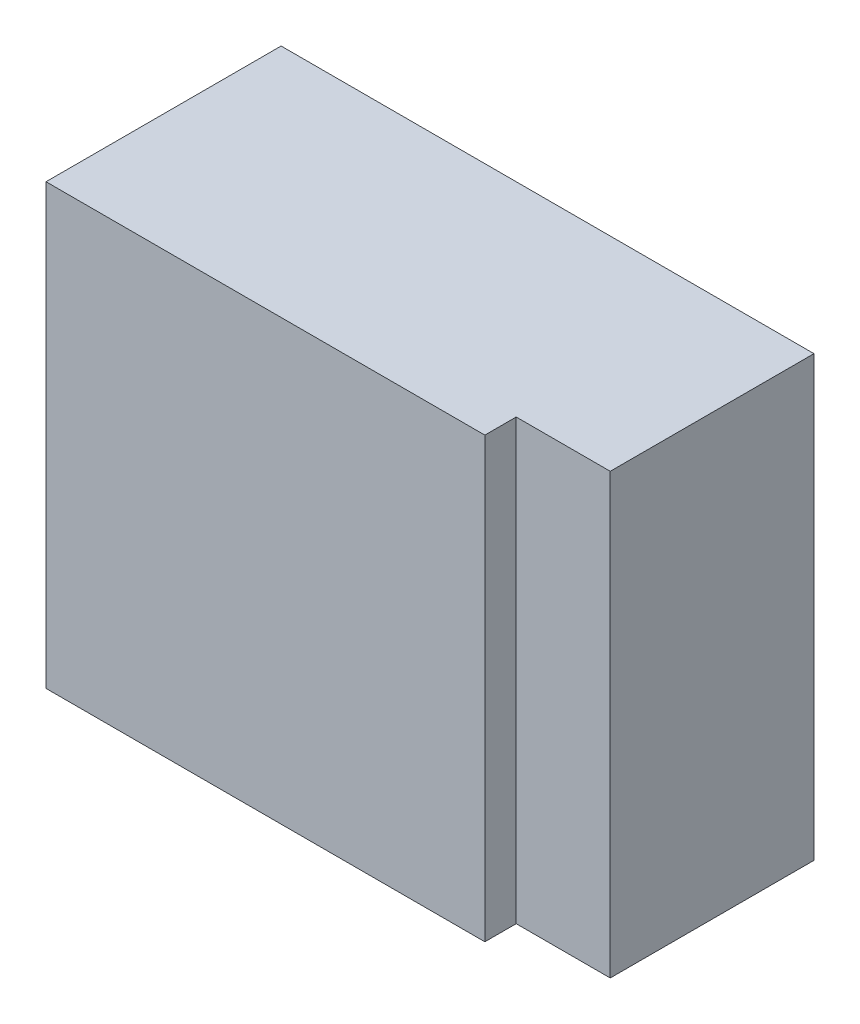
ISO-10303-21;
HEADER;
FILE_DESCRIPTION(('STEP AP214'),'2;1');
FILE_NAME('part.step','',(''),(''),'','','');
FILE_SCHEMA(('AUTOMOTIVE_DESIGN { 1 0 10303 214 1 1 1 1 }'));
ENDSEC;
DATA;
#1=APPLICATION_CONTEXT('core data for automotive mechanical design processes');
#2=APPLICATION_PROTOCOL_DEFINITION('international standard','automotive_design',2000,#1);
#3=PRODUCT_CONTEXT('',#1,'mechanical');
#4=PRODUCT('Part','Part','',(#3));
#5=PRODUCT_RELATED_PRODUCT_CATEGORY('part','',(#4));
#6=PRODUCT_DEFINITION_FORMATION('','',#4);
#7=PRODUCT_DEFINITION_CONTEXT('part definition',#1,'design');
#8=PRODUCT_DEFINITION('design','',#6,#7);
#9=PRODUCT_DEFINITION_SHAPE('','',#8);
#10=(LENGTH_UNIT() NAMED_UNIT(*) SI_UNIT(.MILLI.,.METRE.));
#11=(NAMED_UNIT(*) PLANE_ANGLE_UNIT() SI_UNIT($,.RADIAN.));
#12=(NAMED_UNIT(*) SI_UNIT($,.STERADIAN.) SOLID_ANGLE_UNIT());
#13=UNCERTAINTY_MEASURE_WITH_UNIT(LENGTH_MEASURE(1.E-05),#10,'distance_accuracy_value','');
#14=(GEOMETRIC_REPRESENTATION_CONTEXT(3) GLOBAL_UNCERTAINTY_ASSIGNED_CONTEXT((#13)) GLOBAL_UNIT_ASSIGNED_CONTEXT((#10,
#11,#12)) REPRESENTATION_CONTEXT('',''));
#15=CARTESIAN_POINT('',(0.,0.,0.));
#16=DIRECTION('',(0.,0.,1.));
#17=DIRECTION('',(1.,0.,0.));
#18=AXIS2_PLACEMENT_3D('',#15,#16,#17);
#19=CARTESIAN_POINT('',(1.1,1.4,1.5));
#20=DIRECTION('',(-1.,0.,0.));
#21=DIRECTION('',(0.,0.,1.));
#22=AXIS2_PLACEMENT_3D('',#19,#20,#21);
#23=PLANE('',#22);
#24=DIRECTION('',(0.,0.,1.));
#25=VECTOR('',#24,1.);
#26=CARTESIAN_POINT('',(1.1,-1.4,1.5));
#27=LINE('',#26,#25);
#28=CARTESIAN_POINT('',(1.1,-1.4,1.3));
#29=VERTEX_POINT('',#28);
#30=CARTESIAN_POINT('',(1.1,-1.4,1.5));
#31=VERTEX_POINT('',#30);
#32=EDGE_CURVE('E66',#29,#31,#27,.T.);
#33=ORIENTED_EDGE('',*,*,#32,.F.);
#34=DIRECTION('',(0.,1.,0.));
#35=VECTOR('',#34,1.);
#36=CARTESIAN_POINT('',(1.1,0.,1.3));
#37=LINE('',#36,#35);
#38=CARTESIAN_POINT('',(1.1,1.4,1.3));
#39=VERTEX_POINT('',#38);
#40=EDGE_CURVE('E75',#39,#29,#37,.F.);
#41=ORIENTED_EDGE('',*,*,#40,.F.);
#42=DIRECTION('',(0.,0.,1.));
#43=VECTOR('',#42,1.);
#44=CARTESIAN_POINT('',(1.1,1.4,1.5));
#45=LINE('',#44,#43);
#46=CARTESIAN_POINT('',(1.1,1.4,1.5));
#47=VERTEX_POINT('',#46);
#48=EDGE_CURVE('E20',#47,#39,#45,.F.);
#49=ORIENTED_EDGE('',*,*,#48,.F.);
#50=DIRECTION('',(0.,1.,0.));
#51=VECTOR('',#50,1.);
#52=CARTESIAN_POINT('',(1.1,0.,1.5));
#53=LINE('',#52,#51);
#54=EDGE_CURVE('E85',#31,#47,#53,.T.);
#55=ORIENTED_EDGE('',*,*,#54,.F.);
#56=EDGE_LOOP('',(#33,#41,#49,#55));
#57=FACE_BOUND('',#56,.T.);
#58=ADVANCED_FACE('F17',(#57),#23,.F.);
#59=CARTESIAN_POINT('',(1.4,0.,1.3));
#60=DIRECTION('',(0.,0.,1.));
#61=DIRECTION('',(1.,0.,0.));
#62=AXIS2_PLACEMENT_3D('',#59,#60,#61);
#63=PLANE('',#62);
#64=DIRECTION('',(1.,0.,0.));
#65=VECTOR('',#64,1.);
#66=CARTESIAN_POINT('',(1.7,-1.4,1.3));
#67=LINE('',#66,#65);
#68=CARTESIAN_POINT('',(1.7,-1.4,1.3));
#69=VERTEX_POINT('',#68);
#70=EDGE_CURVE('E96',#69,#29,#67,.F.);
#71=ORIENTED_EDGE('',*,*,#70,.F.);
#72=DIRECTION('',(0.,1.,0.));
#73=VECTOR('',#72,1.);
#74=CARTESIAN_POINT('',(1.7,1.4,1.3));
#75=LINE('',#74,#73);
#76=CARTESIAN_POINT('',(1.7,1.4,1.3));
#77=VERTEX_POINT('',#76);
#78=EDGE_CURVE('E77',#77,#69,#75,.F.);
#79=ORIENTED_EDGE('',*,*,#78,.F.);
#80=DIRECTION('',(1.,0.,0.));
#81=VECTOR('',#80,1.);
#82=CARTESIAN_POINT('',(1.4,1.4,1.3));
#83=LINE('',#82,#81);
#84=EDGE_CURVE('E71',#77,#39,#83,.F.);
#85=ORIENTED_EDGE('',*,*,#84,.T.);
#86=ORIENTED_EDGE('',*,*,#40,.T.);
#87=EDGE_LOOP('',(#71,#79,#85,#86));
#88=FACE_BOUND('',#87,.T.);
#89=ADVANCED_FACE('F74',(#88),#63,.T.);
#90=CARTESIAN_POINT('',(0.,0.,1.5));
#91=DIRECTION('',(0.,0.,1.));
#92=DIRECTION('',(1.,0.,0.));
#93=AXIS2_PLACEMENT_3D('',#90,#91,#92);
#94=PLANE('',#93);
#95=DIRECTION('',(1.,0.,0.));
#96=VECTOR('',#95,1.);
#97=CARTESIAN_POINT('',(1.7,-1.4,1.5));
#98=LINE('',#97,#96);
#99=CARTESIAN_POINT('',(-1.7,-1.4,1.5));
#100=VERTEX_POINT('',#99);
#101=EDGE_CURVE('E93',#31,#100,#98,.F.);
#102=ORIENTED_EDGE('',*,*,#101,.F.);
#103=ORIENTED_EDGE('',*,*,#54,.T.);
#104=DIRECTION('',(1.,0.,0.));
#105=VECTOR('',#104,1.);
#106=CARTESIAN_POINT('',(-1.7,1.4,1.5));
#107=LINE('',#106,#105);
#108=CARTESIAN_POINT('',(-1.7,1.4,1.5));
#109=VERTEX_POINT('',#108);
#110=EDGE_CURVE('E83',#109,#47,#107,.T.);
#111=ORIENTED_EDGE('',*,*,#110,.F.);
#112=DIRECTION('',(0.,1.,0.));
#113=VECTOR('',#112,1.);
#114=CARTESIAN_POINT('',(-1.7,-1.4,1.5));
#115=LINE('',#114,#113);
#116=EDGE_CURVE('E87',#100,#109,#115,.T.);
#117=ORIENTED_EDGE('',*,*,#116,.F.);
#118=EDGE_LOOP('',(#102,#103,#111,#117));
#119=FACE_BOUND('',#118,.T.);
#120=ADVANCED_FACE('F98',(#119),#94,.T.);
#121=CARTESIAN_POINT('',(-1.7,-1.4,0.));
#122=DIRECTION('',(-1.,0.,0.));
#123=DIRECTION('',(0.,0.,1.));
#124=AXIS2_PLACEMENT_3D('',#121,#122,#123);
#125=PLANE('',#124);
#126=DIRECTION('',(0.,0.,1.));
#127=VECTOR('',#126,1.);
#128=CARTESIAN_POINT('',(-1.7,1.4,0.));
#129=LINE('',#128,#127);
#130=CARTESIAN_POINT('',(-1.7,1.4,0.));
#131=VERTEX_POINT('',#130);
#132=EDGE_CURVE('E109',#131,#109,#129,.T.);
#133=ORIENTED_EDGE('',*,*,#132,.F.);
#134=DIRECTION('',(0.,1.,0.));
#135=VECTOR('',#134,1.);
#136=CARTESIAN_POINT('',(-1.7,0.,0.));
#137=LINE('',#136,#135);
#138=CARTESIAN_POINT('',(-1.7,-1.4,0.));
#139=VERTEX_POINT('',#138);
#140=EDGE_CURVE('E113',#131,#139,#137,.F.);
#141=ORIENTED_EDGE('',*,*,#140,.T.);
#142=DIRECTION('',(0.,0.,-1.));
#143=VECTOR('',#142,1.);
#144=CARTESIAN_POINT('',(-1.7,-1.4,0.));
#145=LINE('',#144,#143);
#146=EDGE_CURVE('E100',#100,#139,#145,.T.);
#147=ORIENTED_EDGE('',*,*,#146,.F.);
#148=ORIENTED_EDGE('',*,*,#116,.T.);
#149=EDGE_LOOP('',(#133,#141,#147,#148));
#150=FACE_BOUND('',#149,.T.);
#151=ADVANCED_FACE('F107',(#150),#125,.T.);
#152=CARTESIAN_POINT('',(1.7,-1.4,0.));
#153=DIRECTION('',(0.,-1.,0.));
#154=DIRECTION('',(0.,0.,-1.));
#155=AXIS2_PLACEMENT_3D('',#152,#153,#154);
#156=PLANE('',#155);
#157=ORIENTED_EDGE('',*,*,#101,.T.);
#158=ORIENTED_EDGE('',*,*,#146,.T.);
#159=DIRECTION('',(1.,0.,0.));
#160=VECTOR('',#159,1.);
#161=CARTESIAN_POINT('',(0.,-1.4,0.));
#162=LINE('',#161,#160);
#163=CARTESIAN_POINT('',(1.7,-1.4,0.));
#164=VERTEX_POINT('',#163);
#165=EDGE_CURVE('E123',#139,#164,#162,.T.);
#166=ORIENTED_EDGE('',*,*,#165,.T.);
#167=DIRECTION('',(0.,0.,-1.));
#168=VECTOR('',#167,1.);
#169=CARTESIAN_POINT('',(1.7,-1.4,0.));
#170=LINE('',#169,#168);
#171=EDGE_CURVE('E110',#69,#164,#170,.T.);
#172=ORIENTED_EDGE('',*,*,#171,.F.);
#173=ORIENTED_EDGE('',*,*,#70,.T.);
#174=ORIENTED_EDGE('',*,*,#32,.T.);
#175=EDGE_LOOP('',(#157,#158,#166,#172,#173,#174));
#176=FACE_BOUND('',#175,.T.);
#177=ADVANCED_FACE('F91',(#176),#156,.T.);
#178=CARTESIAN_POINT('',(1.7,1.4,0.));
#179=DIRECTION('',(1.,0.,0.));
#180=DIRECTION('',(0.,0.,-1.));
#181=AXIS2_PLACEMENT_3D('',#178,#179,#180);
#182=PLANE('',#181);
#183=ORIENTED_EDGE('',*,*,#78,.T.);
#184=ORIENTED_EDGE('',*,*,#171,.T.);
#185=DIRECTION('',(0.,1.,0.));
#186=VECTOR('',#185,1.);
#187=CARTESIAN_POINT('',(1.7,0.,0.));
#188=LINE('',#187,#186);
#189=CARTESIAN_POINT('',(1.7,1.4,0.));
#190=VERTEX_POINT('',#189);
#191=EDGE_CURVE('E26',#164,#190,#188,.T.);
#192=ORIENTED_EDGE('',*,*,#191,.T.);
#193=DIRECTION('',(0.,0.,1.));
#194=VECTOR('',#193,1.);
#195=CARTESIAN_POINT('',(1.7,1.4,0.));
#196=LINE('',#195,#194);
#197=EDGE_CURVE('E34',#77,#190,#196,.F.);
#198=ORIENTED_EDGE('',*,*,#197,.F.);
#199=EDGE_LOOP('',(#183,#184,#192,#198));
#200=FACE_BOUND('',#199,.T.);
#201=ADVANCED_FACE('F118',(#200),#182,.T.);
#202=CARTESIAN_POINT('',(-1.7,1.4,0.));
#203=DIRECTION('',(0.,1.,0.));
#204=DIRECTION('',(0.,0.,1.));
#205=AXIS2_PLACEMENT_3D('',#202,#203,#204);
#206=PLANE('',#205);
#207=ORIENTED_EDGE('',*,*,#84,.F.);
#208=ORIENTED_EDGE('',*,*,#197,.T.);
#209=DIRECTION('',(1.,0.,0.));
#210=VECTOR('',#209,1.);
#211=CARTESIAN_POINT('',(0.,1.4,0.));
#212=LINE('',#211,#210);
#213=EDGE_CURVE('E11',#190,#131,#212,.F.);
#214=ORIENTED_EDGE('',*,*,#213,.T.);
#215=ORIENTED_EDGE('',*,*,#132,.T.);
#216=ORIENTED_EDGE('',*,*,#110,.T.);
#217=ORIENTED_EDGE('',*,*,#48,.T.);
#218=EDGE_LOOP('',(#207,#208,#214,#215,#216,#217));
#219=FACE_BOUND('',#218,.T.);
#220=ADVANCED_FACE('F80',(#219),#206,.T.);
#221=CARTESIAN_POINT('',(0.,0.,0.));
#222=DIRECTION('',(0.,0.,1.));
#223=DIRECTION('',(1.,0.,0.));
#224=AXIS2_PLACEMENT_3D('',#221,#222,#223);
#225=PLANE('',#224);
#226=ORIENTED_EDGE('',*,*,#191,.F.);
#227=ORIENTED_EDGE('',*,*,#165,.F.);
#228=ORIENTED_EDGE('',*,*,#140,.F.);
#229=ORIENTED_EDGE('',*,*,#213,.F.);
#230=EDGE_LOOP('',(#226,#227,#228,#229));
#231=FACE_BOUND('',#230,.T.);
#232=ADVANCED_FACE('F127',(#231),#225,.F.);
#233=CLOSED_SHELL('',(#58,#89,#120,#151,#177,#201,#220,#232));
#234=MANIFOLD_SOLID_BREP('B1',#233);
#235=ADVANCED_BREP_SHAPE_REPRESENTATION('',(#18,#234),#14);
#236=SHAPE_DEFINITION_REPRESENTATION(#9,#235);
ENDSEC;
END-ISO-10303-21;
